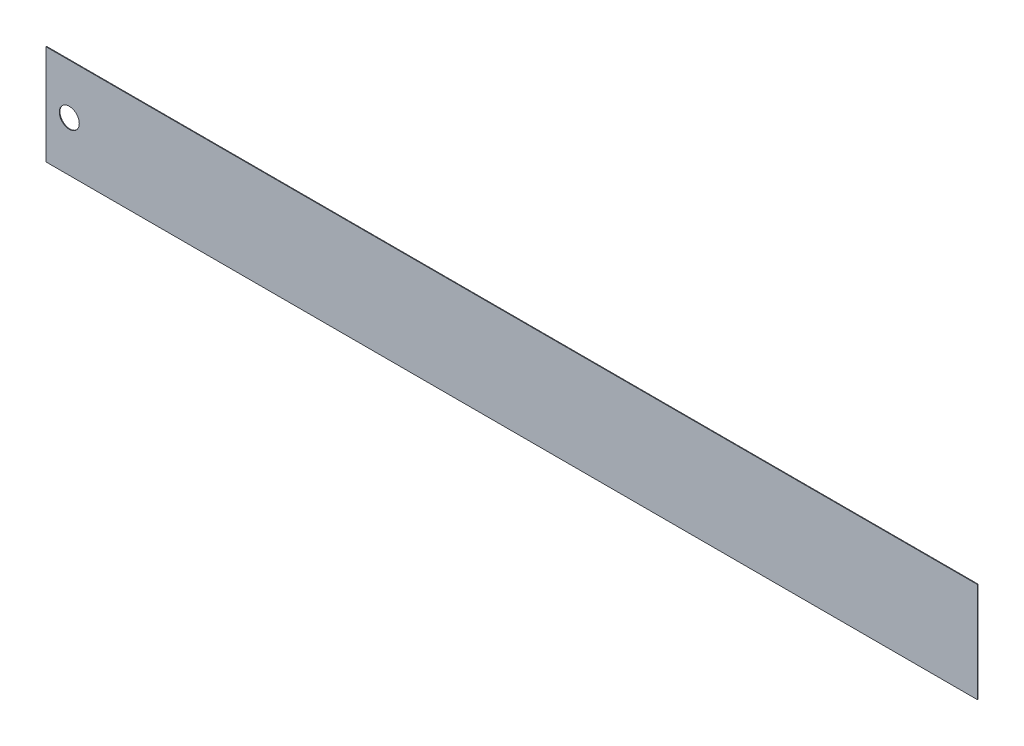
ISO-10303-21;
HEADER;
FILE_DESCRIPTION(('STEP AP214'),'2;1');
FILE_NAME('part.step','',(''),(''),'','','');
FILE_SCHEMA(('AUTOMOTIVE_DESIGN { 1 0 10303 214 1 1 1 1 }'));
ENDSEC;
DATA;
#1=APPLICATION_CONTEXT('core data for automotive mechanical design processes');
#2=APPLICATION_PROTOCOL_DEFINITION('international standard','automotive_design',2000,#1);
#3=PRODUCT_CONTEXT('',#1,'mechanical');
#4=PRODUCT('Part','Part','',(#3));
#5=PRODUCT_RELATED_PRODUCT_CATEGORY('part','',(#4));
#6=PRODUCT_DEFINITION_FORMATION('','',#4);
#7=PRODUCT_DEFINITION_CONTEXT('part definition',#1,'design');
#8=PRODUCT_DEFINITION('design','',#6,#7);
#9=PRODUCT_DEFINITION_SHAPE('','',#8);
#10=(LENGTH_UNIT() NAMED_UNIT(*) SI_UNIT(.MILLI.,.METRE.));
#11=(NAMED_UNIT(*) PLANE_ANGLE_UNIT() SI_UNIT($,.RADIAN.));
#12=(NAMED_UNIT(*) SI_UNIT($,.STERADIAN.) SOLID_ANGLE_UNIT());
#13=UNCERTAINTY_MEASURE_WITH_UNIT(LENGTH_MEASURE(1.E-05),#10,'distance_accuracy_value','');
#14=(GEOMETRIC_REPRESENTATION_CONTEXT(3) GLOBAL_UNCERTAINTY_ASSIGNED_CONTEXT((#13)) GLOBAL_UNIT_ASSIGNED_CONTEXT((#10,
#11,#12)) REPRESENTATION_CONTEXT('',''));
#15=CARTESIAN_POINT('',(0.,0.,0.));
#16=DIRECTION('',(0.,0.,1.));
#17=DIRECTION('',(1.,0.,0.));
#18=AXIS2_PLACEMENT_3D('',#15,#16,#17);
#19=CARTESIAN_POINT('',(0.,0.,0.1));
#20=DIRECTION('',(0.,0.,1.));
#21=DIRECTION('',(1.,0.,0.));
#22=AXIS2_PLACEMENT_3D('',#19,#20,#21);
#23=PLANE('',#22);
#24=DIRECTION('',(0.,-1.,0.));
#25=VECTOR('',#24,1.);
#26=CARTESIAN_POINT('',(-71.5183926645092,24.1197950377562,0.1));
#27=LINE('',#26,#25);
#28=CARTESIAN_POINT('',(-71.5183926645092,24.1197950377562,0.1));
#29=VERTEX_POINT('',#28);
#30=CARTESIAN_POINT('',(-71.5183926645092,9.1197950377562,0.1));
#31=VERTEX_POINT('',#30);
#32=EDGE_CURVE('E89',#29,#31,#27,.T.);
#33=ORIENTED_EDGE('',*,*,#32,.T.);
#34=DIRECTION('',(1.,0.,0.));
#35=VECTOR('',#34,1.);
#36=CARTESIAN_POINT('',(-71.5183926645092,9.1197950377562,0.1));
#37=LINE('',#36,#35);
#38=CARTESIAN_POINT('',(68.4816073354909,9.1197950377562,0.1));
#39=VERTEX_POINT('',#38);
#40=EDGE_CURVE('E84',#31,#39,#37,.T.);
#41=ORIENTED_EDGE('',*,*,#40,.T.);
#42=DIRECTION('',(0.,1.,0.));
#43=VECTOR('',#42,1.);
#44=CARTESIAN_POINT('',(68.4816073354909,24.1197950377562,0.1));
#45=LINE('',#44,#43);
#46=CARTESIAN_POINT('',(68.4816073354909,24.1197950377562,0.1));
#47=VERTEX_POINT('',#46);
#48=EDGE_CURVE('E87',#39,#47,#45,.T.);
#49=ORIENTED_EDGE('',*,*,#48,.T.);
#50=DIRECTION('',(-1.,0.,0.));
#51=VECTOR('',#50,1.);
#52=CARTESIAN_POINT('',(-71.5183926645092,24.1197950377562,0.1));
#53=LINE('',#52,#51);
#54=EDGE_CURVE('E54',#47,#29,#53,.T.);
#55=ORIENTED_EDGE('',*,*,#54,.T.);
#56=EDGE_LOOP('',(#33,#41,#49,#55));
#57=FACE_BOUND('',#56,.T.);
#58=CARTESIAN_POINT('',(-68.0183926645092,16.6197950377562,0.1));
#59=DIRECTION('',(0.,0.,1.));
#60=DIRECTION('',(1.,0.,0.));
#61=AXIS2_PLACEMENT_3D('',#58,#59,#60);
#62=CIRCLE('',#61,1.5);
#63=CARTESIAN_POINT('',(-66.5183926645092,16.6197950377562,0.1));
#64=VERTEX_POINT('',#63);
#65=EDGE_CURVE('E104',#64,#64,#62,.T.);
#66=ORIENTED_EDGE('',*,*,#65,.F.);
#67=EDGE_LOOP('',(#66));
#68=FACE_BOUND('',#67,.T.);
#69=ADVANCED_FACE('F37',(#57,#68),#23,.T.);
#70=CARTESIAN_POINT('',(0.,0.,0.));
#71=DIRECTION('',(0.,0.,1.));
#72=DIRECTION('',(1.,0.,0.));
#73=AXIS2_PLACEMENT_3D('',#70,#71,#72);
#74=PLANE('',#73);
#75=DIRECTION('',(0.,-1.,0.));
#76=VECTOR('',#75,1.);
#77=CARTESIAN_POINT('',(-71.5183926645092,24.1197950377562,0.));
#78=LINE('',#77,#76);
#79=CARTESIAN_POINT('',(-71.5183926645092,24.1197950377562,0.));
#80=VERTEX_POINT('',#79);
#81=CARTESIAN_POINT('',(-71.5183926645092,9.1197950377562,0.));
#82=VERTEX_POINT('',#81);
#83=EDGE_CURVE('E101',#80,#82,#78,.T.);
#84=ORIENTED_EDGE('',*,*,#83,.F.);
#85=DIRECTION('',(-1.,0.,0.));
#86=VECTOR('',#85,1.);
#87=CARTESIAN_POINT('',(-71.5183926645092,24.1197950377562,0.));
#88=LINE('',#87,#86);
#89=CARTESIAN_POINT('',(68.4816073354909,24.1197950377562,0.));
#90=VERTEX_POINT('',#89);
#91=EDGE_CURVE('E77',#90,#80,#88,.T.);
#92=ORIENTED_EDGE('',*,*,#91,.F.);
#93=DIRECTION('',(0.,1.,0.));
#94=VECTOR('',#93,1.);
#95=CARTESIAN_POINT('',(68.4816073354909,24.1197950377562,0.));
#96=LINE('',#95,#94);
#97=CARTESIAN_POINT('',(68.4816073354909,9.1197950377562,0.));
#98=VERTEX_POINT('',#97);
#99=EDGE_CURVE('E71',#98,#90,#96,.T.);
#100=ORIENTED_EDGE('',*,*,#99,.F.);
#101=DIRECTION('',(1.,0.,0.));
#102=VECTOR('',#101,1.);
#103=CARTESIAN_POINT('',(-71.5183926645092,9.1197950377562,0.));
#104=LINE('',#103,#102);
#105=EDGE_CURVE('E93',#82,#98,#104,.T.);
#106=ORIENTED_EDGE('',*,*,#105,.F.);
#107=EDGE_LOOP('',(#84,#92,#100,#106));
#108=FACE_BOUND('',#107,.T.);
#109=CARTESIAN_POINT('',(-68.0183926645092,16.6197950377562,0.));
#110=DIRECTION('',(0.,0.,1.));
#111=DIRECTION('',(1.,0.,0.));
#112=AXIS2_PLACEMENT_3D('',#109,#110,#111);
#113=CIRCLE('',#112,1.5);
#114=CARTESIAN_POINT('',(-66.5183926645092,16.6197950377562,0.));
#115=VERTEX_POINT('',#114);
#116=EDGE_CURVE('E116',#115,#115,#113,.T.);
#117=ORIENTED_EDGE('',*,*,#116,.T.);
#118=EDGE_LOOP('',(#117));
#119=FACE_BOUND('',#118,.T.);
#120=ADVANCED_FACE('F112',(#108,#119),#74,.F.);
#121=CARTESIAN_POINT('',(-71.5183926645092,24.1197950377562,0.1));
#122=DIRECTION('',(1.,0.,0.));
#123=DIRECTION('',(0.,0.,-1.));
#124=AXIS2_PLACEMENT_3D('',#121,#122,#123);
#125=PLANE('',#124);
#126=ORIENTED_EDGE('',*,*,#83,.T.);
#127=DIRECTION('',(0.,0.,-1.));
#128=VECTOR('',#127,1.);
#129=CARTESIAN_POINT('',(-71.5183926645092,9.1197950377562,0.1));
#130=LINE('',#129,#128);
#131=EDGE_CURVE('E11',#31,#82,#130,.T.);
#132=ORIENTED_EDGE('',*,*,#131,.F.);
#133=ORIENTED_EDGE('',*,*,#32,.F.);
#134=DIRECTION('',(0.,0.,-1.));
#135=VECTOR('',#134,1.);
#136=CARTESIAN_POINT('',(-71.5183926645092,24.1197950377562,0.1));
#137=LINE('',#136,#135);
#138=EDGE_CURVE('E97',#29,#80,#137,.T.);
#139=ORIENTED_EDGE('',*,*,#138,.T.);
#140=EDGE_LOOP('',(#126,#132,#133,#139));
#141=FACE_BOUND('',#140,.T.);
#142=ADVANCED_FACE('F39',(#141),#125,.F.);
#143=CARTESIAN_POINT('',(-71.5183926645092,9.1197950377562,0.1));
#144=DIRECTION('',(0.,1.,0.));
#145=DIRECTION('',(0.,0.,1.));
#146=AXIS2_PLACEMENT_3D('',#143,#144,#145);
#147=PLANE('',#146);
#148=ORIENTED_EDGE('',*,*,#105,.T.);
#149=DIRECTION('',(0.,0.,-1.));
#150=VECTOR('',#149,1.);
#151=CARTESIAN_POINT('',(68.4816073354909,9.1197950377562,0.1));
#152=LINE('',#151,#150);
#153=EDGE_CURVE('E46',#39,#98,#152,.T.);
#154=ORIENTED_EDGE('',*,*,#153,.F.);
#155=ORIENTED_EDGE('',*,*,#40,.F.);
#156=ORIENTED_EDGE('',*,*,#131,.T.);
#157=EDGE_LOOP('',(#148,#154,#155,#156));
#158=FACE_BOUND('',#157,.T.);
#159=ADVANCED_FACE('F92',(#158),#147,.F.);
#160=CARTESIAN_POINT('',(68.4816073354909,24.1197950377562,0.1));
#161=DIRECTION('',(-1.,0.,0.));
#162=DIRECTION('',(0.,0.,1.));
#163=AXIS2_PLACEMENT_3D('',#160,#161,#162);
#164=PLANE('',#163);
#165=ORIENTED_EDGE('',*,*,#99,.T.);
#166=DIRECTION('',(0.,0.,-1.));
#167=VECTOR('',#166,1.);
#168=CARTESIAN_POINT('',(68.4816073354909,24.1197950377562,0.1));
#169=LINE('',#168,#167);
#170=EDGE_CURVE('E94',#47,#90,#169,.T.);
#171=ORIENTED_EDGE('',*,*,#170,.F.);
#172=ORIENTED_EDGE('',*,*,#48,.F.);
#173=ORIENTED_EDGE('',*,*,#153,.T.);
#174=EDGE_LOOP('',(#165,#171,#172,#173));
#175=FACE_BOUND('',#174,.T.);
#176=ADVANCED_FACE('F95',(#175),#164,.F.);
#177=CARTESIAN_POINT('',(-71.5183926645092,24.1197950377562,0.1));
#178=DIRECTION('',(0.,-1.,0.));
#179=DIRECTION('',(0.,0.,-1.));
#180=AXIS2_PLACEMENT_3D('',#177,#178,#179);
#181=PLANE('',#180);
#182=ORIENTED_EDGE('',*,*,#91,.T.);
#183=ORIENTED_EDGE('',*,*,#138,.F.);
#184=ORIENTED_EDGE('',*,*,#54,.F.);
#185=ORIENTED_EDGE('',*,*,#170,.T.);
#186=EDGE_LOOP('',(#182,#183,#184,#185));
#187=FACE_BOUND('',#186,.T.);
#188=ADVANCED_FACE('F109',(#187),#181,.F.);
#189=CARTESIAN_POINT('',(-68.0183926645092,16.6197950377562,0.1));
#190=DIRECTION('',(0.,0.,-1.));
#191=DIRECTION('',(-1.,0.,0.));
#192=AXIS2_PLACEMENT_3D('',#189,#190,#191);
#193=CYLINDRICAL_SURFACE('',#192,1.5);
#194=ORIENTED_EDGE('',*,*,#65,.T.);
#195=EDGE_LOOP('',(#194));
#196=FACE_BOUND('',#195,.T.);
#197=ORIENTED_EDGE('',*,*,#116,.F.);
#198=EDGE_LOOP('',(#197));
#199=FACE_BOUND('',#198,.T.);
#200=ADVANCED_FACE('F122',(#196,#199),#193,.F.);
#201=CLOSED_SHELL('',(#69,#120,#142,#159,#176,#188,#200));
#202=MANIFOLD_SOLID_BREP('B2',#201);
#203=ADVANCED_BREP_SHAPE_REPRESENTATION('',(#18,#202),#14);
#204=SHAPE_DEFINITION_REPRESENTATION(#9,#203);
ENDSEC;
END-ISO-10303-21;
